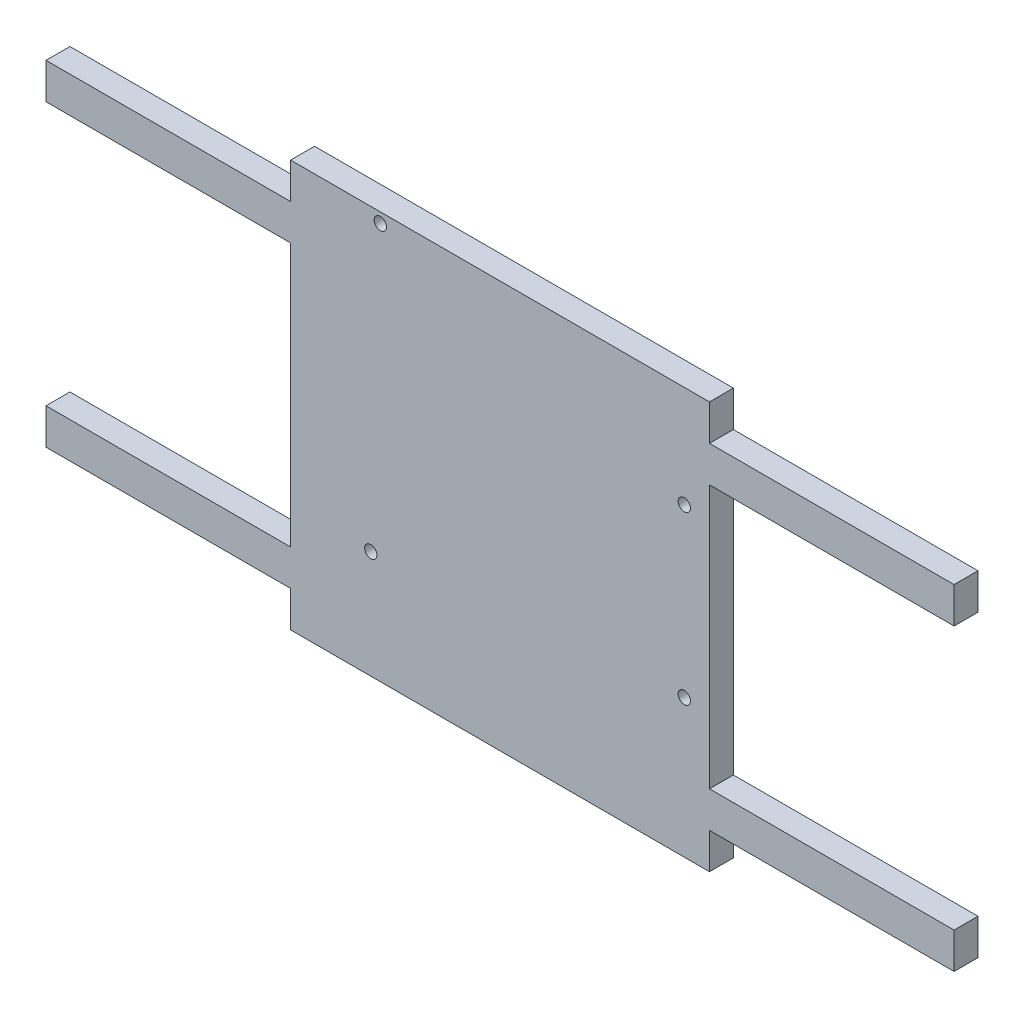
ISO-10303-21;
HEADER;
FILE_DESCRIPTION(('STEP AP214'),'2;1');
FILE_NAME('part.step','',(''),(''),'','','');
FILE_SCHEMA(('AUTOMOTIVE_DESIGN { 1 0 10303 214 1 1 1 1 }'));
ENDSEC;
DATA;
#1=APPLICATION_CONTEXT('core data for automotive mechanical design processes');
#2=APPLICATION_PROTOCOL_DEFINITION('international standard','automotive_design',2000,#1);
#3=PRODUCT_CONTEXT('',#1,'mechanical');
#4=PRODUCT('Part','Part','',(#3));
#5=PRODUCT_RELATED_PRODUCT_CATEGORY('part','',(#4));
#6=PRODUCT_DEFINITION_FORMATION('','',#4);
#7=PRODUCT_DEFINITION_CONTEXT('part definition',#1,'design');
#8=PRODUCT_DEFINITION('design','',#6,#7);
#9=PRODUCT_DEFINITION_SHAPE('','',#8);
#10=(LENGTH_UNIT() NAMED_UNIT(*) SI_UNIT(.MILLI.,.METRE.));
#11=(NAMED_UNIT(*) PLANE_ANGLE_UNIT() SI_UNIT($,.RADIAN.));
#12=(NAMED_UNIT(*) SI_UNIT($,.STERADIAN.) SOLID_ANGLE_UNIT());
#13=UNCERTAINTY_MEASURE_WITH_UNIT(LENGTH_MEASURE(1.E-05),#10,'distance_accuracy_value','');
#14=(GEOMETRIC_REPRESENTATION_CONTEXT(3) GLOBAL_UNCERTAINTY_ASSIGNED_CONTEXT((#13)) GLOBAL_UNIT_ASSIGNED_CONTEXT((#10,
#11,#12)) REPRESENTATION_CONTEXT('',''));
#15=CARTESIAN_POINT('',(0.,0.,0.));
#16=DIRECTION('',(0.,0.,1.));
#17=DIRECTION('',(1.,0.,0.));
#18=AXIS2_PLACEMENT_3D('',#15,#16,#17);
#19=CARTESIAN_POINT('',(-35.,34.,3.99999999999999));
#20=DIRECTION('',(1.,0.,0.));
#21=DIRECTION('',(0.,0.,-1.));
#22=AXIS2_PLACEMENT_3D('',#19,#20,#21);
#23=PLANE('',#22);
#24=DIRECTION('',(0.,-1.,0.));
#25=VECTOR('',#24,1.);
#26=CARTESIAN_POINT('',(-35.,34.,3.99999999999999));
#27=LINE('',#26,#25);
#28=CARTESIAN_POINT('',(-35.,-28.,3.99999999999999));
#29=VERTEX_POINT('',#28);
#30=CARTESIAN_POINT('',(-35.,-34.,3.99999999999999));
#31=VERTEX_POINT('',#30);
#32=EDGE_CURVE('E60',#29,#31,#27,.T.);
#33=ORIENTED_EDGE('',*,*,#32,.F.);
#34=DIRECTION('',(0.,0.,-1.));
#35=VECTOR('',#34,1.);
#36=CARTESIAN_POINT('',(-35.,-28.,4.));
#37=LINE('',#36,#35);
#38=CARTESIAN_POINT('',(-35.,-28.,0.));
#39=VERTEX_POINT('',#38);
#40=EDGE_CURVE('E200',#29,#39,#37,.T.);
#41=ORIENTED_EDGE('',*,*,#40,.T.);
#42=DIRECTION('',(0.,-1.,0.));
#43=VECTOR('',#42,1.);
#44=CARTESIAN_POINT('',(-35.,34.,0.));
#45=LINE('',#44,#43);
#46=CARTESIAN_POINT('',(-35.,-34.,0.));
#47=VERTEX_POINT('',#46);
#48=EDGE_CURVE('E317',#39,#47,#45,.T.);
#49=ORIENTED_EDGE('',*,*,#48,.T.);
#50=DIRECTION('',(0.,0.,-1.));
#51=VECTOR('',#50,1.);
#52=CARTESIAN_POINT('',(-35.,-34.,3.99999999999999));
#53=LINE('',#52,#51);
#54=EDGE_CURVE('E11',#31,#47,#53,.T.);
#55=ORIENTED_EDGE('',*,*,#54,.F.);
#56=EDGE_LOOP('',(#33,#41,#49,#55));
#57=FACE_BOUND('',#56,.T.);
#58=ADVANCED_FACE('F37',(#57),#23,.F.);
#59=CARTESIAN_POINT('',(35.,34.,3.99999999999999));
#60=DIRECTION('',(-1.,0.,0.));
#61=DIRECTION('',(0.,0.,1.));
#62=AXIS2_PLACEMENT_3D('',#59,#60,#61);
#63=PLANE('',#62);
#64=DIRECTION('',(0.,1.,0.));
#65=VECTOR('',#64,1.);
#66=CARTESIAN_POINT('',(35.,34.,0.));
#67=LINE('',#66,#65);
#68=CARTESIAN_POINT('',(35.,-34.,0.));
#69=VERTEX_POINT('',#68);
#70=CARTESIAN_POINT('',(35.,-28.,0.));
#71=VERTEX_POINT('',#70);
#72=EDGE_CURVE('E339',#69,#71,#67,.T.);
#73=ORIENTED_EDGE('',*,*,#72,.T.);
#74=DIRECTION('',(0.,0.,-1.));
#75=VECTOR('',#74,1.);
#76=CARTESIAN_POINT('',(35.,-28.,4.));
#77=LINE('',#76,#75);
#78=CARTESIAN_POINT('',(35.,-28.,3.99999999999999));
#79=VERTEX_POINT('',#78);
#80=EDGE_CURVE('E225',#79,#71,#77,.T.);
#81=ORIENTED_EDGE('',*,*,#80,.F.);
#82=DIRECTION('',(0.,1.,0.));
#83=VECTOR('',#82,1.);
#84=CARTESIAN_POINT('',(35.,34.,3.99999999999999));
#85=LINE('',#84,#83);
#86=CARTESIAN_POINT('',(35.,-34.,3.99999999999999));
#87=VERTEX_POINT('',#86);
#88=EDGE_CURVE('E326',#87,#79,#85,.T.);
#89=ORIENTED_EDGE('',*,*,#88,.F.);
#90=DIRECTION('',(0.,0.,-1.));
#91=VECTOR('',#90,1.);
#92=CARTESIAN_POINT('',(35.,-34.,3.99999999999999));
#93=LINE('',#92,#91);
#94=EDGE_CURVE('E45',#87,#69,#93,.T.);
#95=ORIENTED_EDGE('',*,*,#94,.T.);
#96=EDGE_LOOP('',(#73,#81,#89,#95));
#97=FACE_BOUND('',#96,.T.);
#98=ADVANCED_FACE('F353',(#97),#63,.F.);
#99=CARTESIAN_POINT('',(35.,-22.,3.99999999999999));
#100=VERTEX_POINT('',#99);
#101=CARTESIAN_POINT('',(35.,22.,4.));
#102=VERTEX_POINT('',#101);
#103=EDGE_CURVE('E330',#100,#102,#85,.T.);
#104=ORIENTED_EDGE('',*,*,#103,.F.);
#105=DIRECTION('',(0.,0.,-1.));
#106=VECTOR('',#105,1.);
#107=CARTESIAN_POINT('',(35.,-22.,4.));
#108=LINE('',#107,#106);
#109=CARTESIAN_POINT('',(35.,-22.,0.));
#110=VERTEX_POINT('',#109);
#111=EDGE_CURVE('E238',#100,#110,#108,.T.);
#112=ORIENTED_EDGE('',*,*,#111,.T.);
#113=CARTESIAN_POINT('',(35.,22.,0.));
#114=VERTEX_POINT('',#113);
#115=EDGE_CURVE('E342',#110,#114,#67,.T.);
#116=ORIENTED_EDGE('',*,*,#115,.T.);
#117=DIRECTION('',(0.,0.,-1.));
#118=VECTOR('',#117,1.);
#119=CARTESIAN_POINT('',(35.,22.,4.));
#120=LINE('',#119,#118);
#121=EDGE_CURVE('E265',#102,#114,#120,.T.);
#122=ORIENTED_EDGE('',*,*,#121,.F.);
#123=EDGE_LOOP('',(#104,#112,#116,#122));
#124=FACE_BOUND('',#123,.T.);
#125=ADVANCED_FACE('F398',(#124),#63,.F.);
#126=DIRECTION('',(0.,0.,-1.));
#127=VECTOR('',#126,1.);
#128=CARTESIAN_POINT('',(-35.,28.,4.));
#129=LINE('',#128,#127);
#130=CARTESIAN_POINT('',(-35.,28.,4.));
#131=VERTEX_POINT('',#130);
#132=CARTESIAN_POINT('',(-35.,28.,0.));
#133=VERTEX_POINT('',#132);
#134=EDGE_CURVE('E288',#131,#133,#129,.T.);
#135=ORIENTED_EDGE('',*,*,#134,.F.);
#136=CARTESIAN_POINT('',(-35.,34.,3.99999999999999));
#137=VERTEX_POINT('',#136);
#138=EDGE_CURVE('E320',#137,#131,#27,.T.);
#139=ORIENTED_EDGE('',*,*,#138,.F.);
#140=DIRECTION('',(0.,0.,-1.));
#141=VECTOR('',#140,1.);
#142=CARTESIAN_POINT('',(-35.,34.,3.99999999999999));
#143=LINE('',#142,#141);
#144=CARTESIAN_POINT('',(-35.,34.,0.));
#145=VERTEX_POINT('',#144);
#146=EDGE_CURVE('E332',#137,#145,#143,.T.);
#147=ORIENTED_EDGE('',*,*,#146,.T.);
#148=EDGE_CURVE('E333',#145,#133,#45,.T.);
#149=ORIENTED_EDGE('',*,*,#148,.T.);
#150=EDGE_LOOP('',(#135,#139,#147,#149));
#151=FACE_BOUND('',#150,.T.);
#152=ADVANCED_FACE('F385',(#151),#23,.F.);
#153=CARTESIAN_POINT('',(0.,0.,3.99999999999999));
#154=DIRECTION('',(0.,0.,1.));
#155=DIRECTION('',(1.,0.,0.));
#156=AXIS2_PLACEMENT_3D('',#153,#154,#155);
#157=PLANE('',#156);
#158=CARTESIAN_POINT('',(30.7935271606987,17.0216957549337,3.99999999999999));
#159=DIRECTION('',(0.,0.,1.));
#160=DIRECTION('',(1.,0.,0.));
#161=AXIS2_PLACEMENT_3D('',#158,#159,#160);
#162=CIRCLE('',#161,1.0287);
#163=CARTESIAN_POINT('',(31.8222271606987,17.0216957549337,3.99999999999999));
#164=VERTEX_POINT('',#163);
#165=EDGE_CURVE('E302',#164,#164,#162,.T.);
#166=ORIENTED_EDGE('',*,*,#165,.F.);
#167=EDGE_LOOP('',(#166));
#168=FACE_BOUND('',#167,.T.);
#169=CARTESIAN_POINT('',(-21.6064728393013,-15.9783042450662,3.99999999999999));
#170=DIRECTION('',(0.,0.,1.));
#171=DIRECTION('',(1.,0.,0.));
#172=AXIS2_PLACEMENT_3D('',#169,#170,#171);
#173=CIRCLE('',#172,1.02869999999999);
#174=CARTESIAN_POINT('',(-20.5777728393013,-15.9783042450662,3.99999999999999));
#175=VERTEX_POINT('',#174);
#176=EDGE_CURVE('E314',#175,#175,#173,.T.);
#177=ORIENTED_EDGE('',*,*,#176,.F.);
#178=EDGE_LOOP('',(#177));
#179=FACE_BOUND('',#178,.T.);
#180=ORIENTED_EDGE('',*,*,#138,.T.);
#181=DIRECTION('',(1.,0.,0.));
#182=VECTOR('',#181,1.);
#183=CARTESIAN_POINT('',(-35.,28.,4.));
#184=LINE('',#183,#182);
#185=CARTESIAN_POINT('',(-75.88,28.,4.));
#186=VERTEX_POINT('',#185);
#187=EDGE_CURVE('E278',#186,#131,#184,.T.);
#188=ORIENTED_EDGE('',*,*,#187,.F.);
#189=DIRECTION('',(0.,1.,0.));
#190=VECTOR('',#189,1.);
#191=CARTESIAN_POINT('',(-75.88,28.,4.));
#192=LINE('',#191,#190);
#193=CARTESIAN_POINT('',(-75.88,22.,4.));
#194=VERTEX_POINT('',#193);
#195=EDGE_CURVE('E274',#194,#186,#192,.T.);
#196=ORIENTED_EDGE('',*,*,#195,.F.);
#197=DIRECTION('',(-1.,0.,0.));
#198=VECTOR('',#197,1.);
#199=CARTESIAN_POINT('',(-35.,22.,4.));
#200=LINE('',#199,#198);
#201=CARTESIAN_POINT('',(-35.,22.,4.));
#202=VERTEX_POINT('',#201);
#203=EDGE_CURVE('E271',#202,#194,#200,.T.);
#204=ORIENTED_EDGE('',*,*,#203,.F.);
#205=CARTESIAN_POINT('',(-35.,-22.,3.99999999999999));
#206=VERTEX_POINT('',#205);
#207=EDGE_CURVE('E323',#202,#206,#27,.T.);
#208=ORIENTED_EDGE('',*,*,#207,.T.);
#209=DIRECTION('',(1.,0.,0.));
#210=VECTOR('',#209,1.);
#211=CARTESIAN_POINT('',(-35.,-22.,4.));
#212=LINE('',#211,#210);
#213=CARTESIAN_POINT('',(-75.88,-22.,4.));
#214=VERTEX_POINT('',#213);
#215=EDGE_CURVE('E187',#214,#206,#212,.T.);
#216=ORIENTED_EDGE('',*,*,#215,.F.);
#217=DIRECTION('',(0.,1.,0.));
#218=VECTOR('',#217,1.);
#219=CARTESIAN_POINT('',(-75.88,-28.,4.));
#220=LINE('',#219,#218);
#221=CARTESIAN_POINT('',(-75.88,-28.,4.));
#222=VERTEX_POINT('',#221);
#223=EDGE_CURVE('E179',#222,#214,#220,.T.);
#224=ORIENTED_EDGE('',*,*,#223,.F.);
#225=DIRECTION('',(-1.,0.,0.));
#226=VECTOR('',#225,1.);
#227=CARTESIAN_POINT('',(-35.,-28.,4.));
#228=LINE('',#227,#226);
#229=EDGE_CURVE('E195',#29,#222,#228,.T.);
#230=ORIENTED_EDGE('',*,*,#229,.F.);
#231=ORIENTED_EDGE('',*,*,#32,.T.);
#232=DIRECTION('',(1.,0.,0.));
#233=VECTOR('',#232,1.);
#234=CARTESIAN_POINT('',(-35.,-34.,3.99999999999999));
#235=LINE('',#234,#233);
#236=EDGE_CURVE('E322',#31,#87,#235,.T.);
#237=ORIENTED_EDGE('',*,*,#236,.T.);
#238=ORIENTED_EDGE('',*,*,#88,.T.);
#239=DIRECTION('',(-1.,0.,0.));
#240=VECTOR('',#239,1.);
#241=CARTESIAN_POINT('',(35.,-28.,4.));
#242=LINE('',#241,#240);
#243=CARTESIAN_POINT('',(75.88,-28.,4.));
#244=VERTEX_POINT('',#243);
#245=EDGE_CURVE('E215',#244,#79,#242,.T.);
#246=ORIENTED_EDGE('',*,*,#245,.F.);
#247=DIRECTION('',(0.,-1.,0.));
#248=VECTOR('',#247,1.);
#249=CARTESIAN_POINT('',(75.88,-28.,4.));
#250=LINE('',#249,#248);
#251=CARTESIAN_POINT('',(75.88,-22.,4.));
#252=VERTEX_POINT('',#251);
#253=EDGE_CURVE('E222',#252,#244,#250,.T.);
#254=ORIENTED_EDGE('',*,*,#253,.F.);
#255=DIRECTION('',(1.,0.,0.));
#256=VECTOR('',#255,1.);
#257=CARTESIAN_POINT('',(35.,-22.,4.));
#258=LINE('',#257,#256);
#259=EDGE_CURVE('E218',#100,#252,#258,.T.);
#260=ORIENTED_EDGE('',*,*,#259,.F.);
#261=ORIENTED_EDGE('',*,*,#103,.T.);
#262=DIRECTION('',(-1.,0.,0.));
#263=VECTOR('',#262,1.);
#264=CARTESIAN_POINT('',(35.,22.,4.));
#265=LINE('',#264,#263);
#266=CARTESIAN_POINT('',(75.88,22.,4.));
#267=VERTEX_POINT('',#266);
#268=EDGE_CURVE('E250',#267,#102,#265,.T.);
#269=ORIENTED_EDGE('',*,*,#268,.F.);
#270=DIRECTION('',(0.,-1.,0.));
#271=VECTOR('',#270,1.);
#272=CARTESIAN_POINT('',(75.88,28.,4.));
#273=LINE('',#272,#271);
#274=CARTESIAN_POINT('',(75.88,28.,4.));
#275=VERTEX_POINT('',#274);
#276=EDGE_CURVE('E246',#275,#267,#273,.T.);
#277=ORIENTED_EDGE('',*,*,#276,.F.);
#278=DIRECTION('',(1.,0.,0.));
#279=VECTOR('',#278,1.);
#280=CARTESIAN_POINT('',(35.,28.,4.));
#281=LINE('',#280,#279);
#282=CARTESIAN_POINT('',(35.,28.,4.));
#283=VERTEX_POINT('',#282);
#284=EDGE_CURVE('E243',#283,#275,#281,.T.);
#285=ORIENTED_EDGE('',*,*,#284,.F.);
#286=CARTESIAN_POINT('',(35.,34.,3.99999999999999));
#287=VERTEX_POINT('',#286);
#288=EDGE_CURVE('E325',#283,#287,#85,.T.);
#289=ORIENTED_EDGE('',*,*,#288,.T.);
#290=DIRECTION('',(-1.,0.,0.));
#291=VECTOR('',#290,1.);
#292=CARTESIAN_POINT('',(-35.,34.,3.99999999999999));
#293=LINE('',#292,#291);
#294=EDGE_CURVE('E329',#287,#137,#293,.T.);
#295=ORIENTED_EDGE('',*,*,#294,.T.);
#296=EDGE_LOOP('',(#180,#188,#196,#204,#208,#216,#224,#230,#231,#237,#238,#246,#254,#260,#261,
#269,#277,#285,#289,#295));
#297=FACE_BOUND('',#296,.T.);
#298=CARTESIAN_POINT('',(30.7935271606986,-10.8783042450662,3.99999999999999));
#299=DIRECTION('',(0.,0.,1.));
#300=DIRECTION('',(1.,0.,0.));
#301=AXIS2_PLACEMENT_3D('',#298,#299,#300);
#302=CIRCLE('',#301,1.02869999999999);
#303=CARTESIAN_POINT('',(31.8222271606986,-10.8783042450662,3.99999999999999));
#304=VERTEX_POINT('',#303);
#305=EDGE_CURVE('E308',#304,#304,#302,.T.);
#306=ORIENTED_EDGE('',*,*,#305,.F.);
#307=EDGE_LOOP('',(#306));
#308=FACE_BOUND('',#307,.T.);
#309=CARTESIAN_POINT('',(-20.0064728393013,32.3216957549338,3.99999999999999));
#310=DIRECTION('',(0.,0.,1.));
#311=DIRECTION('',(1.,0.,0.));
#312=AXIS2_PLACEMENT_3D('',#309,#310,#311);
#313=CIRCLE('',#312,1.02869999999999);
#314=CARTESIAN_POINT('',(-18.9777728393013,32.3216957549338,3.99999999999999));
#315=VERTEX_POINT('',#314);
#316=EDGE_CURVE('E296',#315,#315,#313,.T.);
#317=ORIENTED_EDGE('',*,*,#316,.F.);
#318=EDGE_LOOP('',(#317));
#319=FACE_BOUND('',#318,.T.);
#320=ADVANCED_FACE('F193',(#168,#179,#297,#308,#319),#157,.T.);
#321=CARTESIAN_POINT('',(0.,0.,0.));
#322=DIRECTION('',(0.,0.,1.));
#323=DIRECTION('',(1.,0.,0.));
#324=AXIS2_PLACEMENT_3D('',#321,#322,#323);
#325=PLANE('',#324);
#326=ORIENTED_EDGE('',*,*,#148,.F.);
#327=DIRECTION('',(-1.,0.,0.));
#328=VECTOR('',#327,1.);
#329=CARTESIAN_POINT('',(-35.,34.,0.));
#330=LINE('',#329,#328);
#331=CARTESIAN_POINT('',(35.,34.,0.));
#332=VERTEX_POINT('',#331);
#333=EDGE_CURVE('E341',#332,#145,#330,.T.);
#334=ORIENTED_EDGE('',*,*,#333,.F.);
#335=CARTESIAN_POINT('',(35.,28.,0.));
#336=VERTEX_POINT('',#335);
#337=EDGE_CURVE('E338',#336,#332,#67,.T.);
#338=ORIENTED_EDGE('',*,*,#337,.F.);
#339=DIRECTION('',(1.,0.,0.));
#340=VECTOR('',#339,1.);
#341=CARTESIAN_POINT('',(35.,28.,0.));
#342=LINE('',#341,#340);
#343=CARTESIAN_POINT('',(75.88,28.,0.));
#344=VERTEX_POINT('',#343);
#345=EDGE_CURVE('E235',#336,#344,#342,.T.);
#346=ORIENTED_EDGE('',*,*,#345,.T.);
#347=DIRECTION('',(0.,-1.,0.));
#348=VECTOR('',#347,1.);
#349=CARTESIAN_POINT('',(75.88,28.,0.));
#350=LINE('',#349,#348);
#351=CARTESIAN_POINT('',(75.88,22.,0.));
#352=VERTEX_POINT('',#351);
#353=EDGE_CURVE('E256',#344,#352,#350,.T.);
#354=ORIENTED_EDGE('',*,*,#353,.T.);
#355=DIRECTION('',(-1.,0.,0.));
#356=VECTOR('',#355,1.);
#357=CARTESIAN_POINT('',(35.,22.,0.));
#358=LINE('',#357,#356);
#359=EDGE_CURVE('E247',#352,#114,#358,.T.);
#360=ORIENTED_EDGE('',*,*,#359,.T.);
#361=ORIENTED_EDGE('',*,*,#115,.F.);
#362=DIRECTION('',(1.,0.,0.));
#363=VECTOR('',#362,1.);
#364=CARTESIAN_POINT('',(35.,-22.,0.));
#365=LINE('',#364,#363);
#366=CARTESIAN_POINT('',(75.88,-22.,0.));
#367=VERTEX_POINT('',#366);
#368=EDGE_CURVE('E228',#110,#367,#365,.T.);
#369=ORIENTED_EDGE('',*,*,#368,.T.);
#370=DIRECTION('',(0.,-1.,0.));
#371=VECTOR('',#370,1.);
#372=CARTESIAN_POINT('',(75.88,-28.,0.));
#373=LINE('',#372,#371);
#374=CARTESIAN_POINT('',(75.88,-28.,0.));
#375=VERTEX_POINT('',#374);
#376=EDGE_CURVE('E219',#367,#375,#373,.T.);
#377=ORIENTED_EDGE('',*,*,#376,.T.);
#378=DIRECTION('',(-1.,0.,0.));
#379=VECTOR('',#378,1.);
#380=CARTESIAN_POINT('',(35.,-28.,0.));
#381=LINE('',#380,#379);
#382=EDGE_CURVE('E211',#375,#71,#381,.T.);
#383=ORIENTED_EDGE('',*,*,#382,.T.);
#384=ORIENTED_EDGE('',*,*,#72,.F.);
#385=DIRECTION('',(1.,0.,0.));
#386=VECTOR('',#385,1.);
#387=CARTESIAN_POINT('',(-35.,-34.,0.));
#388=LINE('',#387,#386);
#389=EDGE_CURVE('E336',#47,#69,#388,.T.);
#390=ORIENTED_EDGE('',*,*,#389,.F.);
#391=ORIENTED_EDGE('',*,*,#48,.F.);
#392=DIRECTION('',(-1.,0.,0.));
#393=VECTOR('',#392,1.);
#394=CARTESIAN_POINT('',(-35.,-28.,0.));
#395=LINE('',#394,#393);
#396=CARTESIAN_POINT('',(-75.88,-28.,0.));
#397=VERTEX_POINT('',#396);
#398=EDGE_CURVE('E207',#39,#397,#395,.T.);
#399=ORIENTED_EDGE('',*,*,#398,.T.);
#400=DIRECTION('',(0.,1.,0.));
#401=VECTOR('',#400,1.);
#402=CARTESIAN_POINT('',(-75.88,-28.,0.));
#403=LINE('',#402,#401);
#404=CARTESIAN_POINT('',(-75.88,-22.,0.));
#405=VERTEX_POINT('',#404);
#406=EDGE_CURVE('E181',#397,#405,#403,.T.);
#407=ORIENTED_EDGE('',*,*,#406,.T.);
#408=DIRECTION('',(1.,0.,0.));
#409=VECTOR('',#408,1.);
#410=CARTESIAN_POINT('',(-35.,-22.,0.));
#411=LINE('',#410,#409);
#412=CARTESIAN_POINT('',(-35.,-22.,0.));
#413=VERTEX_POINT('',#412);
#414=EDGE_CURVE('E201',#405,#413,#411,.T.);
#415=ORIENTED_EDGE('',*,*,#414,.T.);
#416=CARTESIAN_POINT('',(-35.,22.,0.));
#417=VERTEX_POINT('',#416);
#418=EDGE_CURVE('E52',#417,#413,#45,.T.);
#419=ORIENTED_EDGE('',*,*,#418,.F.);
#420=DIRECTION('',(-1.,0.,0.));
#421=VECTOR('',#420,1.);
#422=CARTESIAN_POINT('',(-35.,22.,0.));
#423=LINE('',#422,#421);
#424=CARTESIAN_POINT('',(-75.88,22.,0.));
#425=VERTEX_POINT('',#424);
#426=EDGE_CURVE('E264',#417,#425,#423,.T.);
#427=ORIENTED_EDGE('',*,*,#426,.T.);
#428=DIRECTION('',(0.,1.,0.));
#429=VECTOR('',#428,1.);
#430=CARTESIAN_POINT('',(-75.88,28.,0.));
#431=LINE('',#430,#429);
#432=CARTESIAN_POINT('',(-75.88,28.,0.));
#433=VERTEX_POINT('',#432);
#434=EDGE_CURVE('E283',#425,#433,#431,.T.);
#435=ORIENTED_EDGE('',*,*,#434,.T.);
#436=DIRECTION('',(1.,0.,0.));
#437=VECTOR('',#436,1.);
#438=CARTESIAN_POINT('',(-35.,28.,0.));
#439=LINE('',#438,#437);
#440=EDGE_CURVE('E275',#433,#133,#439,.T.);
#441=ORIENTED_EDGE('',*,*,#440,.T.);
#442=EDGE_LOOP('',(#326,#334,#338,#346,#354,#360,#361,#369,#377,#383,#384,#390,#391,#399,#407,
#415,#419,#427,#435,#441));
#443=FACE_BOUND('',#442,.T.);
#444=CARTESIAN_POINT('',(-21.6064728393013,-15.9783042450662,0.));
#445=DIRECTION('',(0.,0.,1.));
#446=DIRECTION('',(1.,0.,0.));
#447=AXIS2_PLACEMENT_3D('',#444,#445,#446);
#448=CIRCLE('',#447,1.02869999999999);
#449=CARTESIAN_POINT('',(-20.5777728393013,-15.9783042450662,0.));
#450=VERTEX_POINT('',#449);
#451=EDGE_CURVE('E311',#450,#450,#448,.T.);
#452=ORIENTED_EDGE('',*,*,#451,.T.);
#453=EDGE_LOOP('',(#452));
#454=FACE_BOUND('',#453,.T.);
#455=CARTESIAN_POINT('',(30.7935271606986,-10.8783042450662,0.));
#456=DIRECTION('',(0.,0.,1.));
#457=DIRECTION('',(1.,0.,0.));
#458=AXIS2_PLACEMENT_3D('',#455,#456,#457);
#459=CIRCLE('',#458,1.02869999999999);
#460=CARTESIAN_POINT('',(31.8222271606986,-10.8783042450662,0.));
#461=VERTEX_POINT('',#460);
#462=EDGE_CURVE('E305',#461,#461,#459,.T.);
#463=ORIENTED_EDGE('',*,*,#462,.T.);
#464=EDGE_LOOP('',(#463));
#465=FACE_BOUND('',#464,.T.);
#466=CARTESIAN_POINT('',(30.7935271606987,17.0216957549337,0.));
#467=DIRECTION('',(0.,0.,1.));
#468=DIRECTION('',(1.,0.,0.));
#469=AXIS2_PLACEMENT_3D('',#466,#467,#468);
#470=CIRCLE('',#469,1.0287);
#471=CARTESIAN_POINT('',(31.8222271606987,17.0216957549337,0.));
#472=VERTEX_POINT('',#471);
#473=EDGE_CURVE('E299',#472,#472,#470,.T.);
#474=ORIENTED_EDGE('',*,*,#473,.T.);
#475=EDGE_LOOP('',(#474));
#476=FACE_BOUND('',#475,.T.);
#477=CARTESIAN_POINT('',(-20.0064728393013,32.3216957549338,0.));
#478=DIRECTION('',(0.,0.,1.));
#479=DIRECTION('',(1.,0.,0.));
#480=AXIS2_PLACEMENT_3D('',#477,#478,#479);
#481=CIRCLE('',#480,1.02869999999999);
#482=CARTESIAN_POINT('',(-18.9777728393013,32.3216957549338,0.));
#483=VERTEX_POINT('',#482);
#484=EDGE_CURVE('E290',#483,#483,#481,.T.);
#485=ORIENTED_EDGE('',*,*,#484,.T.);
#486=EDGE_LOOP('',(#485));
#487=FACE_BOUND('',#486,.T.);
#488=ADVANCED_FACE('F359',(#443,#454,#465,#476,#487),#325,.F.);
#489=ORIENTED_EDGE('',*,*,#418,.T.);
#490=DIRECTION('',(0.,0.,-1.));
#491=VECTOR('',#490,1.);
#492=CARTESIAN_POINT('',(-35.,-22.,4.));
#493=LINE('',#492,#491);
#494=EDGE_CURVE('E212',#206,#413,#493,.T.);
#495=ORIENTED_EDGE('',*,*,#494,.F.);
#496=ORIENTED_EDGE('',*,*,#207,.F.);
#497=DIRECTION('',(0.,0.,-1.));
#498=VECTOR('',#497,1.);
#499=CARTESIAN_POINT('',(-35.,22.,4.));
#500=LINE('',#499,#498);
#501=EDGE_CURVE('E280',#202,#417,#500,.T.);
#502=ORIENTED_EDGE('',*,*,#501,.T.);
#503=EDGE_LOOP('',(#489,#495,#496,#502));
#504=FACE_BOUND('',#503,.T.);
#505=ADVANCED_FACE('F39',(#504),#23,.F.);
#506=CARTESIAN_POINT('',(-35.,-34.,3.99999999999999));
#507=DIRECTION('',(0.,1.,0.));
#508=DIRECTION('',(-1.,0.,0.));
#509=AXIS2_PLACEMENT_3D('',#506,#507,#508);
#510=PLANE('',#509);
#511=ORIENTED_EDGE('',*,*,#389,.T.);
#512=ORIENTED_EDGE('',*,*,#94,.F.);
#513=ORIENTED_EDGE('',*,*,#236,.F.);
#514=ORIENTED_EDGE('',*,*,#54,.T.);
#515=EDGE_LOOP('',(#511,#512,#513,#514));
#516=FACE_BOUND('',#515,.T.);
#517=ADVANCED_FACE('F367',(#516),#510,.F.);
#518=ORIENTED_EDGE('',*,*,#288,.F.);
#519=DIRECTION('',(0.,0.,-1.));
#520=VECTOR('',#519,1.);
#521=CARTESIAN_POINT('',(35.,28.,4.));
#522=LINE('',#521,#520);
#523=EDGE_CURVE('E261',#283,#336,#522,.T.);
#524=ORIENTED_EDGE('',*,*,#523,.T.);
#525=ORIENTED_EDGE('',*,*,#337,.T.);
#526=DIRECTION('',(0.,0.,-1.));
#527=VECTOR('',#526,1.);
#528=CARTESIAN_POINT('',(35.,34.,3.99999999999999));
#529=LINE('',#528,#527);
#530=EDGE_CURVE('E346',#287,#332,#529,.T.);
#531=ORIENTED_EDGE('',*,*,#530,.F.);
#532=EDGE_LOOP('',(#518,#524,#525,#531));
#533=FACE_BOUND('',#532,.T.);
#534=ADVANCED_FACE('F428',(#533),#63,.F.);
#535=CARTESIAN_POINT('',(-35.,34.,3.99999999999999));
#536=DIRECTION('',(0.,-1.,0.));
#537=DIRECTION('',(1.,0.,0.));
#538=AXIS2_PLACEMENT_3D('',#535,#536,#537);
#539=PLANE('',#538);
#540=ORIENTED_EDGE('',*,*,#333,.T.);
#541=ORIENTED_EDGE('',*,*,#146,.F.);
#542=ORIENTED_EDGE('',*,*,#294,.F.);
#543=ORIENTED_EDGE('',*,*,#530,.T.);
#544=EDGE_LOOP('',(#540,#541,#542,#543));
#545=FACE_BOUND('',#544,.T.);
#546=ADVANCED_FACE('F392',(#545),#539,.F.);
#547=CARTESIAN_POINT('',(-21.6064728393013,-15.9783042450662,3.99999999999999));
#548=DIRECTION('',(0.,0.,-1.));
#549=DIRECTION('',(-1.,0.,0.));
#550=AXIS2_PLACEMENT_3D('',#547,#548,#549);
#551=CYLINDRICAL_SURFACE('',#550,1.02869999999999);
#552=ORIENTED_EDGE('',*,*,#176,.T.);
#553=EDGE_LOOP('',(#552));
#554=FACE_BOUND('',#553,.T.);
#555=ORIENTED_EDGE('',*,*,#451,.F.);
#556=EDGE_LOOP('',(#555));
#557=FACE_BOUND('',#556,.T.);
#558=ADVANCED_FACE('F444',(#554,#557),#551,.F.);
#559=CARTESIAN_POINT('',(30.7935271606986,-10.8783042450662,3.99999999999999));
#560=DIRECTION('',(0.,0.,-1.));
#561=DIRECTION('',(-1.,0.,0.));
#562=AXIS2_PLACEMENT_3D('',#559,#560,#561);
#563=CYLINDRICAL_SURFACE('',#562,1.02869999999999);
#564=ORIENTED_EDGE('',*,*,#305,.T.);
#565=EDGE_LOOP('',(#564));
#566=FACE_BOUND('',#565,.T.);
#567=ORIENTED_EDGE('',*,*,#462,.F.);
#568=EDGE_LOOP('',(#567));
#569=FACE_BOUND('',#568,.T.);
#570=ADVANCED_FACE('F581',(#566,#569),#563,.F.);
#571=CARTESIAN_POINT('',(30.7935271606987,17.0216957549337,3.99999999999999));
#572=DIRECTION('',(0.,0.,-1.));
#573=DIRECTION('',(-1.,0.,0.));
#574=AXIS2_PLACEMENT_3D('',#571,#572,#573);
#575=CYLINDRICAL_SURFACE('',#574,1.0287);
#576=ORIENTED_EDGE('',*,*,#165,.T.);
#577=EDGE_LOOP('',(#576));
#578=FACE_BOUND('',#577,.T.);
#579=ORIENTED_EDGE('',*,*,#473,.F.);
#580=EDGE_LOOP('',(#579));
#581=FACE_BOUND('',#580,.T.);
#582=ADVANCED_FACE('F577',(#578,#581),#575,.F.);
#583=CARTESIAN_POINT('',(-20.0064728393013,32.3216957549338,3.99999999999999));
#584=DIRECTION('',(0.,0.,-1.));
#585=DIRECTION('',(-1.,0.,0.));
#586=AXIS2_PLACEMENT_3D('',#583,#584,#585);
#587=CYLINDRICAL_SURFACE('',#586,1.02869999999999);
#588=ORIENTED_EDGE('',*,*,#316,.T.);
#589=EDGE_LOOP('',(#588));
#590=FACE_BOUND('',#589,.T.);
#591=ORIENTED_EDGE('',*,*,#484,.F.);
#592=EDGE_LOOP('',(#591));
#593=FACE_BOUND('',#592,.T.);
#594=ADVANCED_FACE('F489',(#590,#593),#587,.F.);
#595=CARTESIAN_POINT('',(-35.,28.,4.));
#596=DIRECTION('',(0.,1.,0.));
#597=DIRECTION('',(0.,0.,1.));
#598=AXIS2_PLACEMENT_3D('',#595,#596,#597);
#599=PLANE('',#598);
#600=ORIENTED_EDGE('',*,*,#440,.F.);
#601=DIRECTION('',(0.,0.,-1.));
#602=VECTOR('',#601,1.);
#603=CARTESIAN_POINT('',(-75.88,28.,4.));
#604=LINE('',#603,#602);
#605=EDGE_CURVE('E291',#186,#433,#604,.T.);
#606=ORIENTED_EDGE('',*,*,#605,.F.);
#607=ORIENTED_EDGE('',*,*,#187,.T.);
#608=ORIENTED_EDGE('',*,*,#134,.T.);
#609=EDGE_LOOP('',(#600,#606,#607,#608));
#610=FACE_BOUND('',#609,.T.);
#611=ADVANCED_FACE('F381',(#610),#599,.T.);
#612=CARTESIAN_POINT('',(-75.88,28.,4.));
#613=DIRECTION('',(-1.,0.,0.));
#614=DIRECTION('',(0.,0.,1.));
#615=AXIS2_PLACEMENT_3D('',#612,#613,#614);
#616=PLANE('',#615);
#617=ORIENTED_EDGE('',*,*,#434,.F.);
#618=DIRECTION('',(0.,0.,-1.));
#619=VECTOR('',#618,1.);
#620=CARTESIAN_POINT('',(-75.88,22.,4.));
#621=LINE('',#620,#619);
#622=EDGE_CURVE('E293',#194,#425,#621,.T.);
#623=ORIENTED_EDGE('',*,*,#622,.F.);
#624=ORIENTED_EDGE('',*,*,#195,.T.);
#625=ORIENTED_EDGE('',*,*,#605,.T.);
#626=EDGE_LOOP('',(#617,#623,#624,#625));
#627=FACE_BOUND('',#626,.T.);
#628=ADVANCED_FACE('F488',(#627),#616,.T.);
#629=CARTESIAN_POINT('',(-35.,22.,4.));
#630=DIRECTION('',(0.,-1.,0.));
#631=DIRECTION('',(1.,0.,0.));
#632=AXIS2_PLACEMENT_3D('',#629,#630,#631);
#633=PLANE('',#632);
#634=ORIENTED_EDGE('',*,*,#426,.F.);
#635=ORIENTED_EDGE('',*,*,#501,.F.);
#636=ORIENTED_EDGE('',*,*,#203,.T.);
#637=ORIENTED_EDGE('',*,*,#622,.T.);
#638=EDGE_LOOP('',(#634,#635,#636,#637));
#639=FACE_BOUND('',#638,.T.);
#640=ADVANCED_FACE('F376',(#639),#633,.T.);
#641=CARTESIAN_POINT('',(35.,28.,4.));
#642=DIRECTION('',(0.,1.,0.));
#643=DIRECTION('',(0.,0.,1.));
#644=AXIS2_PLACEMENT_3D('',#641,#642,#643);
#645=PLANE('',#644);
#646=ORIENTED_EDGE('',*,*,#345,.F.);
#647=ORIENTED_EDGE('',*,*,#523,.F.);
#648=ORIENTED_EDGE('',*,*,#284,.T.);
#649=DIRECTION('',(0.,0.,-1.));
#650=VECTOR('',#649,1.);
#651=CARTESIAN_POINT('',(75.88,28.,4.));
#652=LINE('',#651,#650);
#653=EDGE_CURVE('E253',#275,#344,#652,.T.);
#654=ORIENTED_EDGE('',*,*,#653,.T.);
#655=EDGE_LOOP('',(#646,#647,#648,#654));
#656=FACE_BOUND('',#655,.T.);
#657=ADVANCED_FACE('F507',(#656),#645,.T.);
#658=CARTESIAN_POINT('',(35.,22.,4.));
#659=DIRECTION('',(0.,-1.,0.));
#660=DIRECTION('',(1.,0.,0.));
#661=AXIS2_PLACEMENT_3D('',#658,#659,#660);
#662=PLANE('',#661);
#663=ORIENTED_EDGE('',*,*,#359,.F.);
#664=DIRECTION('',(0.,0.,-1.));
#665=VECTOR('',#664,1.);
#666=CARTESIAN_POINT('',(75.88,22.,4.));
#667=LINE('',#666,#665);
#668=EDGE_CURVE('E268',#267,#352,#667,.T.);
#669=ORIENTED_EDGE('',*,*,#668,.F.);
#670=ORIENTED_EDGE('',*,*,#268,.T.);
#671=ORIENTED_EDGE('',*,*,#121,.T.);
#672=EDGE_LOOP('',(#663,#669,#670,#671));
#673=FACE_BOUND('',#672,.T.);
#674=ADVANCED_FACE('F403',(#673),#662,.T.);
#675=CARTESIAN_POINT('',(75.88,28.,4.));
#676=DIRECTION('',(1.,0.,0.));
#677=DIRECTION('',(0.,0.,-1.));
#678=AXIS2_PLACEMENT_3D('',#675,#676,#677);
#679=PLANE('',#678);
#680=ORIENTED_EDGE('',*,*,#353,.F.);
#681=ORIENTED_EDGE('',*,*,#653,.F.);
#682=ORIENTED_EDGE('',*,*,#276,.T.);
#683=ORIENTED_EDGE('',*,*,#668,.T.);
#684=EDGE_LOOP('',(#680,#681,#682,#683));
#685=FACE_BOUND('',#684,.T.);
#686=ADVANCED_FACE('F407',(#685),#679,.T.);
#687=CARTESIAN_POINT('',(35.,-28.,4.));
#688=DIRECTION('',(0.,-1.,0.));
#689=DIRECTION('',(1.,0.,0.));
#690=AXIS2_PLACEMENT_3D('',#687,#688,#689);
#691=PLANE('',#690);
#692=ORIENTED_EDGE('',*,*,#382,.F.);
#693=DIRECTION('',(0.,0.,-1.));
#694=VECTOR('',#693,1.);
#695=CARTESIAN_POINT('',(75.88,-28.,4.));
#696=LINE('',#695,#694);
#697=EDGE_CURVE('E233',#244,#375,#696,.T.);
#698=ORIENTED_EDGE('',*,*,#697,.F.);
#699=ORIENTED_EDGE('',*,*,#245,.T.);
#700=ORIENTED_EDGE('',*,*,#80,.T.);
#701=EDGE_LOOP('',(#692,#698,#699,#700));
#702=FACE_BOUND('',#701,.T.);
#703=ADVANCED_FACE('F364',(#702),#691,.T.);
#704=CARTESIAN_POINT('',(75.88,-28.,4.));
#705=DIRECTION('',(1.,0.,0.));
#706=DIRECTION('',(0.,0.,-1.));
#707=AXIS2_PLACEMENT_3D('',#704,#705,#706);
#708=PLANE('',#707);
#709=ORIENTED_EDGE('',*,*,#376,.F.);
#710=DIRECTION('',(0.,0.,-1.));
#711=VECTOR('',#710,1.);
#712=CARTESIAN_POINT('',(75.88,-22.,4.));
#713=LINE('',#712,#711);
#714=EDGE_CURVE('E236',#252,#367,#713,.T.);
#715=ORIENTED_EDGE('',*,*,#714,.F.);
#716=ORIENTED_EDGE('',*,*,#253,.T.);
#717=ORIENTED_EDGE('',*,*,#697,.T.);
#718=EDGE_LOOP('',(#709,#715,#716,#717));
#719=FACE_BOUND('',#718,.T.);
#720=ADVANCED_FACE('F413',(#719),#708,.T.);
#721=CARTESIAN_POINT('',(35.,-22.,4.));
#722=DIRECTION('',(0.,1.,0.));
#723=DIRECTION('',(-1.,0.,0.));
#724=AXIS2_PLACEMENT_3D('',#721,#722,#723);
#725=PLANE('',#724);
#726=ORIENTED_EDGE('',*,*,#368,.F.);
#727=ORIENTED_EDGE('',*,*,#111,.F.);
#728=ORIENTED_EDGE('',*,*,#259,.T.);
#729=ORIENTED_EDGE('',*,*,#714,.T.);
#730=EDGE_LOOP('',(#726,#727,#728,#729));
#731=FACE_BOUND('',#730,.T.);
#732=ADVANCED_FACE('F411',(#731),#725,.T.);
#733=CARTESIAN_POINT('',(-35.,-28.,4.));
#734=DIRECTION('',(0.,-1.,0.));
#735=DIRECTION('',(1.,0.,0.));
#736=AXIS2_PLACEMENT_3D('',#733,#734,#735);
#737=PLANE('',#736);
#738=ORIENTED_EDGE('',*,*,#398,.F.);
#739=ORIENTED_EDGE('',*,*,#40,.F.);
#740=ORIENTED_EDGE('',*,*,#229,.T.);
#741=DIRECTION('',(0.,0.,-1.));
#742=VECTOR('',#741,1.);
#743=CARTESIAN_POINT('',(-75.88,-28.,4.));
#744=LINE('',#743,#742);
#745=EDGE_CURVE('E176',#222,#397,#744,.T.);
#746=ORIENTED_EDGE('',*,*,#745,.T.);
#747=EDGE_LOOP('',(#738,#739,#740,#746));
#748=FACE_BOUND('',#747,.T.);
#749=ADVANCED_FACE('F199',(#748),#737,.T.);
#750=CARTESIAN_POINT('',(-35.,-22.,4.));
#751=DIRECTION('',(0.,1.,0.));
#752=DIRECTION('',(-1.,0.,0.));
#753=AXIS2_PLACEMENT_3D('',#750,#751,#752);
#754=PLANE('',#753);
#755=ORIENTED_EDGE('',*,*,#414,.F.);
#756=DIRECTION('',(0.,0.,-1.));
#757=VECTOR('',#756,1.);
#758=CARTESIAN_POINT('',(-75.88,-22.,4.));
#759=LINE('',#758,#757);
#760=EDGE_CURVE('E186',#214,#405,#759,.T.);
#761=ORIENTED_EDGE('',*,*,#760,.F.);
#762=ORIENTED_EDGE('',*,*,#215,.T.);
#763=ORIENTED_EDGE('',*,*,#494,.T.);
#764=EDGE_LOOP('',(#755,#761,#762,#763));
#765=FACE_BOUND('',#764,.T.);
#766=ADVANCED_FACE('F370',(#765),#754,.T.);
#767=CARTESIAN_POINT('',(-75.88,-28.,4.));
#768=DIRECTION('',(-1.,0.,0.));
#769=DIRECTION('',(0.,0.,1.));
#770=AXIS2_PLACEMENT_3D('',#767,#768,#769);
#771=PLANE('',#770);
#772=ORIENTED_EDGE('',*,*,#406,.F.);
#773=ORIENTED_EDGE('',*,*,#745,.F.);
#774=ORIENTED_EDGE('',*,*,#223,.T.);
#775=ORIENTED_EDGE('',*,*,#760,.T.);
#776=EDGE_LOOP('',(#772,#773,#774,#775));
#777=FACE_BOUND('',#776,.T.);
#778=ADVANCED_FACE('F178',(#777),#771,.T.);
#779=CLOSED_SHELL('',(#58,#98,#125,#152,#320,#488,#505,#517,#534,#546,#558,#570,#582,#594,#611,
#628,#640,#657,#674,#686,#703,#720,#732,#749,#766,#778));
#780=MANIFOLD_SOLID_BREP('B2',#779);
#781=ADVANCED_BREP_SHAPE_REPRESENTATION('',(#18,#780),#14);
#782=SHAPE_DEFINITION_REPRESENTATION(#9,#781);
ENDSEC;
END-ISO-10303-21;
